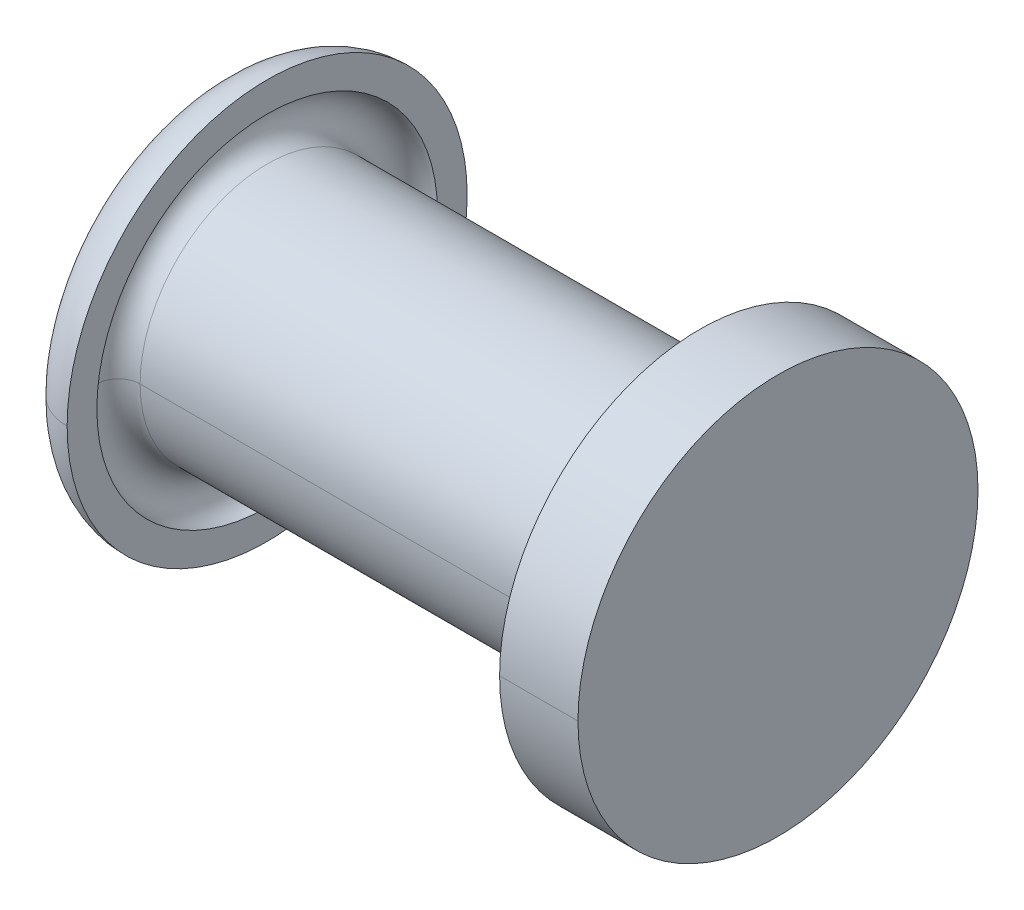
ISO-10303-21;
HEADER;
FILE_DESCRIPTION(('STEP AP214'),'2;1');
FILE_NAME('part.step','',(''),(''),'','','');
FILE_SCHEMA(('AUTOMOTIVE_DESIGN { 1 0 10303 214 1 1 1 1 }'));
ENDSEC;
DATA;
#1=APPLICATION_CONTEXT('core data for automotive mechanical design processes');
#2=APPLICATION_PROTOCOL_DEFINITION('international standard','automotive_design',2000,#1);
#3=PRODUCT_CONTEXT('',#1,'mechanical');
#4=PRODUCT('Part','Part','',(#3));
#5=PRODUCT_RELATED_PRODUCT_CATEGORY('part','',(#4));
#6=PRODUCT_DEFINITION_FORMATION('','',#4);
#7=PRODUCT_DEFINITION_CONTEXT('part definition',#1,'design');
#8=PRODUCT_DEFINITION('design','',#6,#7);
#9=PRODUCT_DEFINITION_SHAPE('','',#8);
#10=(LENGTH_UNIT() NAMED_UNIT(*) SI_UNIT(.MILLI.,.METRE.));
#11=(NAMED_UNIT(*) PLANE_ANGLE_UNIT() SI_UNIT($,.RADIAN.));
#12=(NAMED_UNIT(*) SI_UNIT($,.STERADIAN.) SOLID_ANGLE_UNIT());
#13=UNCERTAINTY_MEASURE_WITH_UNIT(LENGTH_MEASURE(1.E-05),#10,'distance_accuracy_value','');
#14=(GEOMETRIC_REPRESENTATION_CONTEXT(3) GLOBAL_UNCERTAINTY_ASSIGNED_CONTEXT((#13)) GLOBAL_UNIT_ASSIGNED_CONTEXT((#10,
#11,#12)) REPRESENTATION_CONTEXT('',''));
#15=CARTESIAN_POINT('',(0.,0.,0.));
#16=DIRECTION('',(0.,0.,1.));
#17=DIRECTION('',(1.,0.,0.));
#18=AXIS2_PLACEMENT_3D('',#15,#16,#17);
#19=CARTESIAN_POINT('',(2.7686,0.,0.));
#20=DIRECTION('',(-1.,0.,0.));
#21=DIRECTION('',(0.,0.,1.));
#22=AXIS2_PLACEMENT_3D('',#19,#20,#21);
#23=PLANE('',#22);
#24=CARTESIAN_POINT('',(2.76860000000002,0.,0.));
#25=DIRECTION('',(1.,0.,0.));
#26=DIRECTION('',(0.,0.,1.));
#27=AXIS2_PLACEMENT_3D('',#24,#25,#26);
#28=CIRCLE('',#27,1.8796);
#29=CARTESIAN_POINT('',(2.76860000000001,0.,1.8796));
#30=VERTEX_POINT('',#29);
#31=CARTESIAN_POINT('',(2.76860000000001,0.,-1.8796));
#32=VERTEX_POINT('',#31);
#33=EDGE_CURVE('E11',#30,#32,#28,.T.);
#34=ORIENTED_EDGE('',*,*,#33,.T.);
#35=CARTESIAN_POINT('',(2.76860000000002,0.,0.));
#36=DIRECTION('',(1.,0.,0.));
#37=DIRECTION('',(0.,0.,-1.));
#38=AXIS2_PLACEMENT_3D('',#35,#36,#37);
#39=CIRCLE('',#38,1.8796);
#40=EDGE_CURVE('E143',#32,#30,#39,.T.);
#41=ORIENTED_EDGE('',*,*,#40,.T.);
#42=EDGE_LOOP('',(#34,#41));
#43=FACE_BOUND('',#42,.T.);
#44=ADVANCED_FACE('F17',(#43),#23,.F.);
#45=CARTESIAN_POINT('',(33.1437784338811,0.,0.));
#46=DIRECTION('',(1.,0.,0.));
#47=DIRECTION('',(0.,0.,-1.));
#48=AXIS2_PLACEMENT_3D('',#45,#46,#47);
#49=CYLINDRICAL_SURFACE('',#48,1.8796);
#50=CARTESIAN_POINT('',(2.03199999999998,0.,0.));
#51=DIRECTION('',(-1.,0.,0.));
#52=DIRECTION('',(0.,0.,-1.));
#53=AXIS2_PLACEMENT_3D('',#50,#51,#52);
#54=CIRCLE('',#53,1.8796);
#55=CARTESIAN_POINT('',(2.03199999999999,0.,-1.8796));
#56=VERTEX_POINT('',#55);
#57=CARTESIAN_POINT('',(2.03199999999999,0.,1.8796));
#58=VERTEX_POINT('',#57);
#59=EDGE_CURVE('E39',#56,#58,#54,.T.);
#60=ORIENTED_EDGE('',*,*,#59,.F.);
#61=DIRECTION('',(-1.,0.,0.));
#62=VECTOR('',#61,1.);
#63=CARTESIAN_POINT('',(2.76860000000002,0.,-1.8796));
#64=LINE('',#63,#62);
#65=EDGE_CURVE('E131',#32,#56,#64,.T.);
#66=ORIENTED_EDGE('',*,*,#65,.F.);
#67=ORIENTED_EDGE('',*,*,#33,.F.);
#68=DIRECTION('',(-1.,0.,0.));
#69=VECTOR('',#68,1.);
#70=CARTESIAN_POINT('',(2.76860000000002,0.,1.8796));
#71=LINE('',#70,#69);
#72=EDGE_CURVE('E24',#30,#58,#71,.T.);
#73=ORIENTED_EDGE('',*,*,#72,.T.);
#74=EDGE_LOOP('',(#60,#66,#67,#73));
#75=FACE_BOUND('',#74,.T.);
#76=ADVANCED_FACE('F150',(#75),#49,.T.);
#77=CARTESIAN_POINT('',(33.1437784338811,0.,0.));
#78=DIRECTION('',(1.,0.,0.));
#79=DIRECTION('',(0.,0.,-1.));
#80=AXIS2_PLACEMENT_3D('',#77,#78,#79);
#81=CYLINDRICAL_SURFACE('',#80,1.8796);
#82=ORIENTED_EDGE('',*,*,#72,.F.);
#83=ORIENTED_EDGE('',*,*,#40,.F.);
#84=ORIENTED_EDGE('',*,*,#65,.T.);
#85=CARTESIAN_POINT('',(2.03199999999998,0.,0.));
#86=DIRECTION('',(-1.,0.,0.));
#87=DIRECTION('',(0.,0.,1.));
#88=AXIS2_PLACEMENT_3D('',#85,#86,#87);
#89=CIRCLE('',#88,1.8796);
#90=EDGE_CURVE('E130',#58,#56,#89,.T.);
#91=ORIENTED_EDGE('',*,*,#90,.F.);
#92=EDGE_LOOP('',(#82,#83,#84,#91));
#93=FACE_BOUND('',#92,.T.);
#94=ADVANCED_FACE('F149',(#93),#81,.T.);
#95=CARTESIAN_POINT('',(2.032,-1.8796,0.));
#96=DIRECTION('',(1.,0.,0.));
#97=DIRECTION('',(0.,0.,-1.));
#98=AXIS2_PLACEMENT_3D('',#95,#96,#97);
#99=PLANE('',#98);
#100=CARTESIAN_POINT('',(2.03199999999998,0.,0.));
#101=DIRECTION('',(1.,0.,0.));
#102=DIRECTION('',(0.,0.,1.));
#103=AXIS2_PLACEMENT_3D('',#100,#101,#102);
#104=CIRCLE('',#103,1.1938);
#105=CARTESIAN_POINT('',(2.03199999999999,0.,1.1938));
#106=VERTEX_POINT('',#105);
#107=CARTESIAN_POINT('',(2.03199999999999,0.,-1.1938));
#108=VERTEX_POINT('',#107);
#109=EDGE_CURVE('E137',#106,#108,#104,.T.);
#110=ORIENTED_EDGE('',*,*,#109,.T.);
#111=CARTESIAN_POINT('',(2.03199999999998,0.,0.));
#112=DIRECTION('',(1.,0.,0.));
#113=DIRECTION('',(0.,0.,-1.));
#114=AXIS2_PLACEMENT_3D('',#111,#112,#113);
#115=CIRCLE('',#114,1.1938);
#116=EDGE_CURVE('E135',#108,#106,#115,.T.);
#117=ORIENTED_EDGE('',*,*,#116,.T.);
#118=EDGE_LOOP('',(#110,#117));
#119=FACE_BOUND('',#118,.T.);
#120=ORIENTED_EDGE('',*,*,#59,.T.);
#121=ORIENTED_EDGE('',*,*,#90,.T.);
#122=EDGE_LOOP('',(#120,#121));
#123=FACE_BOUND('',#122,.T.);
#124=ADVANCED_FACE('F151',(#119,#123),#99,.F.);
#125=CARTESIAN_POINT('',(-1.45717304996129,0.,0.));
#126=DIRECTION('',(-1.,0.,0.));
#127=DIRECTION('',(0.,0.,1.));
#128=AXIS2_PLACEMENT_3D('',#125,#126,#127);
#129=CONICAL_SURFACE('',#128,0.,1.02974425867666);
#130=DIRECTION('',(0.515038074910051,0.,-0.857167300702114));
#131=VECTOR('',#130,1.);
#132=CARTESIAN_POINT('',(-2.00660000000006,0.,0.914399999999962));
#133=LINE('',#132,#131);
#134=CARTESIAN_POINT('',(-2.00660000000003,0.,0.914399999999981));
#135=VERTEX_POINT('',#134);
#136=CARTESIAN_POINT('',(-1.45717304996129,0.,0.));
#137=VERTEX_POINT('',#136);
#138=EDGE_CURVE('E125',#135,#137,#133,.T.);
#139=ORIENTED_EDGE('',*,*,#138,.F.);
#140=CARTESIAN_POINT('',(-2.00660000000006,0.,0.));
#141=DIRECTION('',(-1.,0.,0.));
#142=DIRECTION('',(0.,0.,1.));
#143=AXIS2_PLACEMENT_3D('',#140,#141,#142);
#144=CIRCLE('',#143,0.914399999999962);
#145=CARTESIAN_POINT('',(-2.00660000000003,0.,-0.914399999999981));
#146=VERTEX_POINT('',#145);
#147=EDGE_CURVE('E102',#135,#146,#144,.T.);
#148=ORIENTED_EDGE('',*,*,#147,.T.);
#149=DIRECTION('',(0.515038074910051,0.,0.857167300702114));
#150=VECTOR('',#149,1.);
#151=CARTESIAN_POINT('',(-2.00660000000006,0.,-0.914399999999962));
#152=LINE('',#151,#150);
#153=EDGE_CURVE('E33',#146,#137,#152,.T.);
#154=ORIENTED_EDGE('',*,*,#153,.T.);
#155=EDGE_LOOP('',(#139,#148,#154));
#156=FACE_BOUND('',#155,.T.);
#157=ADVANCED_FACE('F153',(#156),#129,.F.);
#158=CARTESIAN_POINT('',(-1.45717304996129,0.,0.));
#159=DIRECTION('',(-1.,0.,0.));
#160=DIRECTION('',(0.,0.,1.));
#161=AXIS2_PLACEMENT_3D('',#158,#159,#160);
#162=CONICAL_SURFACE('',#161,0.,1.02974425867666);
#163=ORIENTED_EDGE('',*,*,#153,.F.);
#164=CARTESIAN_POINT('',(-2.00660000000006,0.,0.));
#165=DIRECTION('',(-1.,0.,0.));
#166=DIRECTION('',(0.,0.,-1.));
#167=AXIS2_PLACEMENT_3D('',#164,#165,#166);
#168=CIRCLE('',#167,0.914399999999962);
#169=EDGE_CURVE('E94',#146,#135,#168,.T.);
#170=ORIENTED_EDGE('',*,*,#169,.T.);
#171=ORIENTED_EDGE('',*,*,#138,.T.);
#172=EDGE_LOOP('',(#163,#170,#171));
#173=FACE_BOUND('',#172,.T.);
#174=ADVANCED_FACE('F161',(#173),#162,.F.);
#175=CARTESIAN_POINT('',(-2.032,0.,0.));
#176=DIRECTION('',(1.,0.,0.));
#177=DIRECTION('',(0.,0.,-1.));
#178=AXIS2_PLACEMENT_3D('',#175,#176,#177);
#179=TOROIDAL_SURFACE('',#178,1.397,0.4826);
#180=CARTESIAN_POINT('',(-2.032,0.,0.));
#181=DIRECTION('',(1.,0.,0.));
#182=DIRECTION('',(0.,0.,1.));
#183=AXIS2_PLACEMENT_3D('',#180,#181,#182);
#184=CIRCLE('',#183,0.9144);
#185=CARTESIAN_POINT('',(-2.03199999999999,0.,0.9144));
#186=VERTEX_POINT('',#185);
#187=CARTESIAN_POINT('',(-2.03199999999999,0.,-0.9144));
#188=VERTEX_POINT('',#187);
#189=EDGE_CURVE('E84',#186,#188,#184,.T.);
#190=ORIENTED_EDGE('',*,*,#189,.T.);
#191=CARTESIAN_POINT('',(-2.032,0.,-1.397));
#192=DIRECTION('',(0.,1.,0.));
#193=DIRECTION('',(0.,0.,-1.));
#194=AXIS2_PLACEMENT_3D('',#191,#192,#193);
#195=CIRCLE('',#194,0.4826);
#196=CARTESIAN_POINT('',(-2.032,0.,-1.8796));
#197=VERTEX_POINT('',#196);
#198=EDGE_CURVE('E87',#197,#188,#195,.T.);
#199=ORIENTED_EDGE('',*,*,#198,.F.);
#200=CARTESIAN_POINT('',(-2.032,0.,0.));
#201=DIRECTION('',(1.,0.,0.));
#202=DIRECTION('',(0.,0.,1.));
#203=AXIS2_PLACEMENT_3D('',#200,#201,#202);
#204=CIRCLE('',#203,1.8796);
#205=CARTESIAN_POINT('',(-2.032,0.,1.8796));
#206=VERTEX_POINT('',#205);
#207=EDGE_CURVE('E112',#206,#197,#204,.T.);
#208=ORIENTED_EDGE('',*,*,#207,.F.);
#209=CARTESIAN_POINT('',(-2.032,0.,1.397));
#210=DIRECTION('',(0.,-1.,0.));
#211=DIRECTION('',(0.,0.,1.));
#212=AXIS2_PLACEMENT_3D('',#209,#210,#211);
#213=CIRCLE('',#212,0.4826);
#214=EDGE_CURVE('E89',#206,#186,#213,.T.);
#215=ORIENTED_EDGE('',*,*,#214,.T.);
#216=EDGE_LOOP('',(#190,#199,#208,#215));
#217=FACE_BOUND('',#216,.T.);
#218=ADVANCED_FACE('F83',(#217),#179,.T.);
#219=CARTESIAN_POINT('',(33.1437784338811,0.,0.));
#220=DIRECTION('',(1.,0.,0.));
#221=DIRECTION('',(0.,0.,-1.));
#222=AXIS2_PLACEMENT_3D('',#219,#220,#221);
#223=CYLINDRICAL_SURFACE('',#222,0.9144);
#224=DIRECTION('',(-1.,0.,0.));
#225=VECTOR('',#224,1.);
#226=CARTESIAN_POINT('',(-2.0066,0.,0.9144));
#227=LINE('',#226,#225);
#228=EDGE_CURVE('E108',#135,#186,#227,.T.);
#229=ORIENTED_EDGE('',*,*,#228,.F.);
#230=ORIENTED_EDGE('',*,*,#169,.F.);
#231=DIRECTION('',(-1.,0.,0.));
#232=VECTOR('',#231,1.);
#233=CARTESIAN_POINT('',(-2.0066,0.,-0.9144));
#234=LINE('',#233,#232);
#235=EDGE_CURVE('E92',#146,#188,#234,.T.);
#236=ORIENTED_EDGE('',*,*,#235,.T.);
#237=ORIENTED_EDGE('',*,*,#189,.F.);
#238=EDGE_LOOP('',(#229,#230,#236,#237));
#239=FACE_BOUND('',#238,.T.);
#240=ADVANCED_FACE('F99',(#239),#223,.F.);
#241=CARTESIAN_POINT('',(33.1437784338811,0.,0.));
#242=DIRECTION('',(1.,0.,0.));
#243=DIRECTION('',(0.,0.,-1.));
#244=AXIS2_PLACEMENT_3D('',#241,#242,#243);
#245=CYLINDRICAL_SURFACE('',#244,0.9144);
#246=CARTESIAN_POINT('',(-2.032,0.,0.));
#247=DIRECTION('',(1.,0.,0.));
#248=DIRECTION('',(0.,0.,-1.));
#249=AXIS2_PLACEMENT_3D('',#246,#247,#248);
#250=CIRCLE('',#249,0.9144);
#251=EDGE_CURVE('E110',#188,#186,#250,.T.);
#252=ORIENTED_EDGE('',*,*,#251,.F.);
#253=ORIENTED_EDGE('',*,*,#235,.F.);
#254=ORIENTED_EDGE('',*,*,#147,.F.);
#255=ORIENTED_EDGE('',*,*,#228,.T.);
#256=EDGE_LOOP('',(#252,#253,#254,#255));
#257=FACE_BOUND('',#256,.T.);
#258=ADVANCED_FACE('F107',(#257),#245,.F.);
#259=CARTESIAN_POINT('',(-2.032,0.,0.));
#260=DIRECTION('',(1.,0.,0.));
#261=DIRECTION('',(0.,0.,-1.));
#262=AXIS2_PLACEMENT_3D('',#259,#260,#261);
#263=TOROIDAL_SURFACE('',#262,1.397,0.4826);
#264=ORIENTED_EDGE('',*,*,#214,.F.);
#265=CARTESIAN_POINT('',(-2.032,0.,0.));
#266=DIRECTION('',(1.,0.,0.));
#267=DIRECTION('',(0.,0.,-1.));
#268=AXIS2_PLACEMENT_3D('',#265,#266,#267);
#269=CIRCLE('',#268,1.8796);
#270=EDGE_CURVE('E113',#197,#206,#269,.T.);
#271=ORIENTED_EDGE('',*,*,#270,.F.);
#272=ORIENTED_EDGE('',*,*,#198,.T.);
#273=ORIENTED_EDGE('',*,*,#251,.T.);
#274=EDGE_LOOP('',(#264,#271,#272,#273));
#275=FACE_BOUND('',#274,.T.);
#276=ADVANCED_FACE('F114',(#275),#263,.T.);
#277=CARTESIAN_POINT('',(-2.032,-1.6002,0.));
#278=DIRECTION('',(-1.,0.,0.));
#279=DIRECTION('',(0.,0.,1.));
#280=AXIS2_PLACEMENT_3D('',#277,#278,#279);
#281=PLANE('',#280);
#282=CARTESIAN_POINT('',(-2.032,0.,0.));
#283=DIRECTION('',(-1.,0.,0.));
#284=DIRECTION('',(0.,0.,-1.));
#285=AXIS2_PLACEMENT_3D('',#282,#283,#284);
#286=CIRCLE('',#285,1.6002);
#287=CARTESIAN_POINT('',(-2.032,0.,-1.6002));
#288=VERTEX_POINT('',#287);
#289=CARTESIAN_POINT('',(-2.032,0.,1.6002));
#290=VERTEX_POINT('',#289);
#291=EDGE_CURVE('E407',#288,#290,#286,.T.);
#292=ORIENTED_EDGE('',*,*,#291,.T.);
#293=CARTESIAN_POINT('',(-2.032,0.,0.));
#294=DIRECTION('',(-1.,0.,0.));
#295=DIRECTION('',(0.,0.,1.));
#296=AXIS2_PLACEMENT_3D('',#293,#294,#295);
#297=CIRCLE('',#296,1.6002);
#298=EDGE_CURVE('E408',#290,#288,#297,.T.);
#299=ORIENTED_EDGE('',*,*,#298,.T.);
#300=EDGE_LOOP('',(#292,#299));
#301=FACE_BOUND('',#300,.T.);
#302=ORIENTED_EDGE('',*,*,#207,.T.);
#303=ORIENTED_EDGE('',*,*,#270,.T.);
#304=EDGE_LOOP('',(#302,#303));
#305=FACE_BOUND('',#304,.T.);
#306=ADVANCED_FACE('F235',(#301,#305),#281,.F.);
#307=CARTESIAN_POINT('',(-2.032,0.,0.));
#308=DIRECTION('',(1.,0.,0.));
#309=DIRECTION('',(0.,0.,-1.));
#310=AXIS2_PLACEMENT_3D('',#307,#308,#309);
#311=TOROIDAL_SURFACE('',#310,1.397,0.2032);
#312=CARTESIAN_POINT('',(-2.032,0.,1.397));
#313=DIRECTION('',(0.,-1.,0.));
#314=DIRECTION('',(0.,0.,1.));
#315=AXIS2_PLACEMENT_3D('',#312,#313,#314);
#316=CIRCLE('',#315,0.2032);
#317=CARTESIAN_POINT('',(-2.03199999999999,0.,1.1938));
#318=VERTEX_POINT('',#317);
#319=EDGE_CURVE('E133',#290,#318,#316,.T.);
#320=ORIENTED_EDGE('',*,*,#319,.F.);
#321=ORIENTED_EDGE('',*,*,#291,.F.);
#322=CARTESIAN_POINT('',(-2.032,0.,-1.397));
#323=DIRECTION('',(0.,1.,0.));
#324=DIRECTION('',(0.,0.,-1.));
#325=AXIS2_PLACEMENT_3D('',#322,#323,#324);
#326=CIRCLE('',#325,0.2032);
#327=CARTESIAN_POINT('',(-2.03199999999999,0.,-1.1938));
#328=VERTEX_POINT('',#327);
#329=EDGE_CURVE('E406',#288,#328,#326,.T.);
#330=ORIENTED_EDGE('',*,*,#329,.T.);
#331=CARTESIAN_POINT('',(-2.032,0.,0.));
#332=DIRECTION('',(-1.,0.,0.));
#333=DIRECTION('',(0.,0.,-1.));
#334=AXIS2_PLACEMENT_3D('',#331,#332,#333);
#335=CIRCLE('',#334,1.1938);
#336=EDGE_CURVE('E393',#328,#318,#335,.T.);
#337=ORIENTED_EDGE('',*,*,#336,.T.);
#338=EDGE_LOOP('',(#320,#321,#330,#337));
#339=FACE_BOUND('',#338,.T.);
#340=ADVANCED_FACE('F241',(#339),#311,.F.);
#341=CARTESIAN_POINT('',(-2.032,0.,0.));
#342=DIRECTION('',(1.,0.,0.));
#343=DIRECTION('',(0.,0.,-1.));
#344=AXIS2_PLACEMENT_3D('',#341,#342,#343);
#345=TOROIDAL_SURFACE('',#344,1.397,0.2032);
#346=CARTESIAN_POINT('',(-2.032,0.,0.));
#347=DIRECTION('',(-1.,0.,0.));
#348=DIRECTION('',(0.,0.,1.));
#349=AXIS2_PLACEMENT_3D('',#346,#347,#348);
#350=CIRCLE('',#349,1.1938);
#351=EDGE_CURVE('E134',#318,#328,#350,.T.);
#352=ORIENTED_EDGE('',*,*,#351,.T.);
#353=ORIENTED_EDGE('',*,*,#329,.F.);
#354=ORIENTED_EDGE('',*,*,#298,.F.);
#355=ORIENTED_EDGE('',*,*,#319,.T.);
#356=EDGE_LOOP('',(#352,#353,#354,#355));
#357=FACE_BOUND('',#356,.T.);
#358=ADVANCED_FACE('F253',(#357),#345,.F.);
#359=CARTESIAN_POINT('',(33.1437784338811,0.,0.));
#360=DIRECTION('',(1.,0.,0.));
#361=DIRECTION('',(0.,0.,-1.));
#362=AXIS2_PLACEMENT_3D('',#359,#360,#361);
#363=CYLINDRICAL_SURFACE('',#362,1.1938);
#364=DIRECTION('',(-1.,0.,0.));
#365=VECTOR('',#364,1.);
#366=CARTESIAN_POINT('',(2.03199999999998,0.,1.1938));
#367=LINE('',#366,#365);
#368=EDGE_CURVE('E136',#106,#318,#367,.T.);
#369=ORIENTED_EDGE('',*,*,#368,.F.);
#370=ORIENTED_EDGE('',*,*,#116,.F.);
#371=DIRECTION('',(-1.,0.,0.));
#372=VECTOR('',#371,1.);
#373=CARTESIAN_POINT('',(2.03199999999998,0.,-1.1938));
#374=LINE('',#373,#372);
#375=EDGE_CURVE('E139',#108,#328,#374,.T.);
#376=ORIENTED_EDGE('',*,*,#375,.T.);
#377=ORIENTED_EDGE('',*,*,#351,.F.);
#378=EDGE_LOOP('',(#369,#370,#376,#377));
#379=FACE_BOUND('',#378,.T.);
#380=ADVANCED_FACE('F261',(#379),#363,.T.);
#381=CARTESIAN_POINT('',(33.1437784338811,0.,0.));
#382=DIRECTION('',(1.,0.,0.));
#383=DIRECTION('',(0.,0.,-1.));
#384=AXIS2_PLACEMENT_3D('',#381,#382,#383);
#385=CYLINDRICAL_SURFACE('',#384,1.1938);
#386=ORIENTED_EDGE('',*,*,#336,.F.);
#387=ORIENTED_EDGE('',*,*,#375,.F.);
#388=ORIENTED_EDGE('',*,*,#109,.F.);
#389=ORIENTED_EDGE('',*,*,#368,.T.);
#390=EDGE_LOOP('',(#386,#387,#388,#389));
#391=FACE_BOUND('',#390,.T.);
#392=ADVANCED_FACE('F271',(#391),#385,.T.);
#393=CLOSED_SHELL('',(#44,#76,#94,#124,#157,#174,#218,#240,#258,#276,#306,#340,#358,#380,#392));
#394=MANIFOLD_SOLID_BREP('B1',#393);
#395=ADVANCED_BREP_SHAPE_REPRESENTATION('',(#18,#394),#14);
#396=SHAPE_DEFINITION_REPRESENTATION(#9,#395);
ENDSEC;
END-ISO-10303-21;
